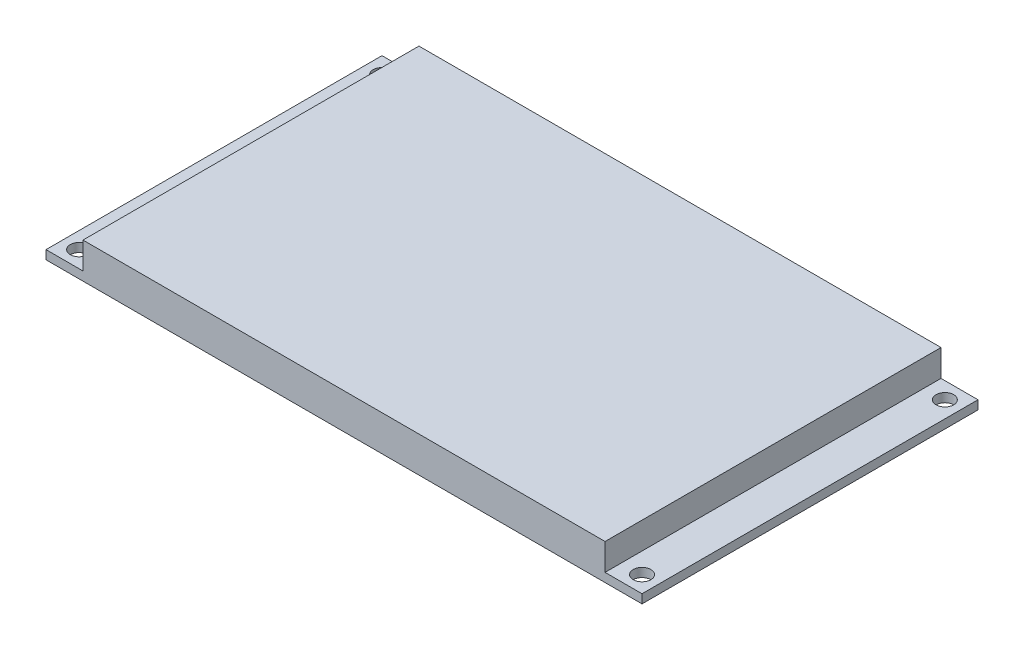
ISO-10303-21;
HEADER;
FILE_DESCRIPTION(('STEP AP214'),'2;1');
FILE_NAME('part.step','',(''),(''),'','','');
FILE_SCHEMA(('AUTOMOTIVE_DESIGN { 1 0 10303 214 1 1 1 1 }'));
ENDSEC;
DATA;
#1=APPLICATION_CONTEXT('core data for automotive mechanical design processes');
#2=APPLICATION_PROTOCOL_DEFINITION('international standard','automotive_design',2000,#1);
#3=PRODUCT_CONTEXT('',#1,'mechanical');
#4=PRODUCT('Part','Part','',(#3));
#5=PRODUCT_RELATED_PRODUCT_CATEGORY('part','',(#4));
#6=PRODUCT_DEFINITION_FORMATION('','',#4);
#7=PRODUCT_DEFINITION_CONTEXT('part definition',#1,'design');
#8=PRODUCT_DEFINITION('design','',#6,#7);
#9=PRODUCT_DEFINITION_SHAPE('','',#8);
#10=(LENGTH_UNIT() NAMED_UNIT(*) SI_UNIT(.MILLI.,.METRE.));
#11=(NAMED_UNIT(*) PLANE_ANGLE_UNIT() SI_UNIT($,.RADIAN.));
#12=(NAMED_UNIT(*) SI_UNIT($,.STERADIAN.) SOLID_ANGLE_UNIT());
#13=UNCERTAINTY_MEASURE_WITH_UNIT(LENGTH_MEASURE(1.E-05),#10,'distance_accuracy_value','');
#14=(GEOMETRIC_REPRESENTATION_CONTEXT(3) GLOBAL_UNCERTAINTY_ASSIGNED_CONTEXT((#13)) GLOBAL_UNIT_ASSIGNED_CONTEXT((#10,
#11,#12)) REPRESENTATION_CONTEXT('',''));
#15=CARTESIAN_POINT('',(0.,0.,0.));
#16=DIRECTION('',(0.,0.,1.));
#17=DIRECTION('',(1.,0.,0.));
#18=AXIS2_PLACEMENT_3D('',#15,#16,#17);
#19=CARTESIAN_POINT('',(0.,1.6,0.));
#20=DIRECTION('',(0.,-1.,0.));
#21=DIRECTION('',(0.,0.,-1.));
#22=AXIS2_PLACEMENT_3D('',#19,#20,#21);
#23=PLANE('',#22);
#24=CARTESIAN_POINT('',(3.,1.6,-3.));
#25=DIRECTION('',(0.,1.,0.));
#26=DIRECTION('',(0.,0.,1.));
#27=AXIS2_PLACEMENT_3D('',#24,#25,#26);
#28=CIRCLE('',#27,1.6);
#29=CARTESIAN_POINT('',(3.,1.6,-1.4));
#30=VERTEX_POINT('',#29);
#31=EDGE_CURVE('E198',#30,#30,#28,.T.);
#32=ORIENTED_EDGE('',*,*,#31,.F.);
#33=EDGE_LOOP('',(#32));
#34=FACE_BOUND('',#33,.T.);
#35=CARTESIAN_POINT('',(3.,1.6,-57.88));
#36=DIRECTION('',(0.,1.,0.));
#37=DIRECTION('',(0.,0.,1.));
#38=AXIS2_PLACEMENT_3D('',#35,#36,#37);
#39=CIRCLE('',#38,1.6);
#40=CARTESIAN_POINT('',(3.,1.6,-56.28));
#41=VERTEX_POINT('',#40);
#42=EDGE_CURVE('E204',#41,#41,#39,.T.);
#43=ORIENTED_EDGE('',*,*,#42,.F.);
#44=EDGE_LOOP('',(#43));
#45=FACE_BOUND('',#44,.T.);
#46=DIRECTION('',(0.,0.,1.));
#47=VECTOR('',#46,1.);
#48=CARTESIAN_POINT('',(6.7,1.6,-60.88));
#49=LINE('',#48,#47);
#50=CARTESIAN_POINT('',(6.7,1.6,-60.88));
#51=VERTEX_POINT('',#50);
#52=CARTESIAN_POINT('',(6.7,1.6,0.));
#53=VERTEX_POINT('',#52);
#54=EDGE_CURVE('E153',#51,#53,#49,.T.);
#55=ORIENTED_EDGE('',*,*,#54,.F.);
#56=DIRECTION('',(-1.,0.,0.));
#57=VECTOR('',#56,1.);
#58=CARTESIAN_POINT('',(0.,1.6,-60.88));
#59=LINE('',#58,#57);
#60=CARTESIAN_POINT('',(0.,1.6,-60.88));
#61=VERTEX_POINT('',#60);
#62=EDGE_CURVE('E218',#51,#61,#59,.T.);
#63=ORIENTED_EDGE('',*,*,#62,.T.);
#64=DIRECTION('',(0.,0.,1.));
#65=VECTOR('',#64,1.);
#66=CARTESIAN_POINT('',(0.,1.6,0.));
#67=LINE('',#66,#65);
#68=CARTESIAN_POINT('',(0.,1.6,0.));
#69=VERTEX_POINT('',#68);
#70=EDGE_CURVE('E209',#61,#69,#67,.T.);
#71=ORIENTED_EDGE('',*,*,#70,.T.);
#72=DIRECTION('',(1.,0.,0.));
#73=VECTOR('',#72,1.);
#74=CARTESIAN_POINT('',(0.,1.6,0.));
#75=LINE('',#74,#73);
#76=EDGE_CURVE('E214',#69,#53,#75,.T.);
#77=ORIENTED_EDGE('',*,*,#76,.T.);
#78=EDGE_LOOP('',(#55,#63,#71,#77));
#79=FACE_BOUND('',#78,.T.);
#80=ADVANCED_FACE('F41',(#34,#45,#79),#23,.F.);
#81=CARTESIAN_POINT('',(105.,1.6,-57.88));
#82=DIRECTION('',(0.,1.,0.));
#83=DIRECTION('',(0.,0.,-1.));
#84=AXIS2_PLACEMENT_3D('',#81,#82,#83);
#85=CIRCLE('',#84,1.6);
#86=CARTESIAN_POINT('',(105.,1.6,-59.48));
#87=VERTEX_POINT('',#86);
#88=EDGE_CURVE('E186',#87,#87,#85,.T.);
#89=ORIENTED_EDGE('',*,*,#88,.F.);
#90=EDGE_LOOP('',(#89));
#91=FACE_BOUND('',#90,.T.);
#92=CARTESIAN_POINT('',(105.,1.6,-3.));
#93=DIRECTION('',(0.,1.,0.));
#94=DIRECTION('',(0.,0.,-1.));
#95=AXIS2_PLACEMENT_3D('',#92,#93,#94);
#96=CIRCLE('',#95,1.6);
#97=CARTESIAN_POINT('',(105.,1.6,-4.6));
#98=VERTEX_POINT('',#97);
#99=EDGE_CURVE('E192',#98,#98,#96,.T.);
#100=ORIENTED_EDGE('',*,*,#99,.F.);
#101=EDGE_LOOP('',(#100));
#102=FACE_BOUND('',#101,.T.);
#103=DIRECTION('',(0.,0.,-1.));
#104=VECTOR('',#103,1.);
#105=CARTESIAN_POINT('',(101.3,1.6,-60.88));
#106=LINE('',#105,#104);
#107=CARTESIAN_POINT('',(101.3,1.6,0.));
#108=VERTEX_POINT('',#107);
#109=CARTESIAN_POINT('',(101.3,1.6,-60.88));
#110=VERTEX_POINT('',#109);
#111=EDGE_CURVE('E156',#108,#110,#106,.T.);
#112=ORIENTED_EDGE('',*,*,#111,.F.);
#113=CARTESIAN_POINT('',(108.,1.6,0.));
#114=VERTEX_POINT('',#113);
#115=EDGE_CURVE('E212',#108,#114,#75,.T.);
#116=ORIENTED_EDGE('',*,*,#115,.T.);
#117=DIRECTION('',(0.,0.,-1.));
#118=VECTOR('',#117,1.);
#119=CARTESIAN_POINT('',(108.,1.6,0.));
#120=LINE('',#119,#118);
#121=CARTESIAN_POINT('',(108.,1.6,-60.88));
#122=VERTEX_POINT('',#121);
#123=EDGE_CURVE('E216',#114,#122,#120,.T.);
#124=ORIENTED_EDGE('',*,*,#123,.T.);
#125=EDGE_CURVE('E219',#122,#110,#59,.T.);
#126=ORIENTED_EDGE('',*,*,#125,.T.);
#127=EDGE_LOOP('',(#112,#116,#124,#126));
#128=FACE_BOUND('',#127,.T.);
#129=ADVANCED_FACE('F265',(#91,#102,#128),#23,.F.);
#130=CARTESIAN_POINT('',(0.,0.,0.));
#131=DIRECTION('',(0.,-1.,0.));
#132=DIRECTION('',(0.,0.,-1.));
#133=AXIS2_PLACEMENT_3D('',#130,#131,#132);
#134=PLANE('',#133);
#135=DIRECTION('',(-1.,0.,0.));
#136=VECTOR('',#135,1.);
#137=CARTESIAN_POINT('',(0.,0.,-12.66));
#138=LINE('',#137,#136);
#139=CARTESIAN_POINT('',(3.,0.,-12.66));
#140=VERTEX_POINT('',#139);
#141=CARTESIAN_POINT('',(0.,0.,-12.66));
#142=VERTEX_POINT('',#141);
#143=EDGE_CURVE('E56',#140,#142,#138,.T.);
#144=ORIENTED_EDGE('',*,*,#143,.F.);
#145=DIRECTION('',(0.,0.,1.));
#146=VECTOR('',#145,1.);
#147=CARTESIAN_POINT('',(3.,0.,-12.66));
#148=LINE('',#147,#146);
#149=CARTESIAN_POINT('',(3.,0.,-48.22));
#150=VERTEX_POINT('',#149);
#151=EDGE_CURVE('E445',#150,#140,#148,.T.);
#152=ORIENTED_EDGE('',*,*,#151,.F.);
#153=DIRECTION('',(1.,0.,0.));
#154=VECTOR('',#153,1.);
#155=CARTESIAN_POINT('',(0.,0.,-48.22));
#156=LINE('',#155,#154);
#157=CARTESIAN_POINT('',(0.,0.,-48.22));
#158=VERTEX_POINT('',#157);
#159=EDGE_CURVE('E451',#158,#150,#156,.T.);
#160=ORIENTED_EDGE('',*,*,#159,.F.);
#161=DIRECTION('',(0.,0.,1.));
#162=VECTOR('',#161,1.);
#163=CARTESIAN_POINT('',(0.,0.,0.));
#164=LINE('',#163,#162);
#165=CARTESIAN_POINT('',(0.,0.,-60.88));
#166=VERTEX_POINT('',#165);
#167=EDGE_CURVE('E152',#166,#158,#164,.T.);
#168=ORIENTED_EDGE('',*,*,#167,.F.);
#169=DIRECTION('',(-1.,0.,0.));
#170=VECTOR('',#169,1.);
#171=CARTESIAN_POINT('',(0.,0.,-60.88));
#172=LINE('',#171,#170);
#173=CARTESIAN_POINT('',(108.,0.,-60.88));
#174=VERTEX_POINT('',#173);
#175=EDGE_CURVE('E213',#174,#166,#172,.T.);
#176=ORIENTED_EDGE('',*,*,#175,.F.);
#177=DIRECTION('',(0.,0.,-1.));
#178=VECTOR('',#177,1.);
#179=CARTESIAN_POINT('',(108.,0.,0.));
#180=LINE('',#179,#178);
#181=CARTESIAN_POINT('',(108.,0.,0.));
#182=VERTEX_POINT('',#181);
#183=EDGE_CURVE('E225',#182,#174,#180,.T.);
#184=ORIENTED_EDGE('',*,*,#183,.F.);
#185=DIRECTION('',(1.,0.,0.));
#186=VECTOR('',#185,1.);
#187=CARTESIAN_POINT('',(0.,0.,0.));
#188=LINE('',#187,#186);
#189=CARTESIAN_POINT('',(0.,0.,0.));
#190=VERTEX_POINT('',#189);
#191=EDGE_CURVE('E223',#190,#182,#188,.T.);
#192=ORIENTED_EDGE('',*,*,#191,.F.);
#193=EDGE_CURVE('E61',#142,#190,#164,.T.);
#194=ORIENTED_EDGE('',*,*,#193,.F.);
#195=EDGE_LOOP('',(#144,#152,#160,#168,#176,#184,#192,#194));
#196=FACE_BOUND('',#195,.T.);
#197=CARTESIAN_POINT('',(105.,0.,-3.));
#198=DIRECTION('',(0.,1.,0.));
#199=DIRECTION('',(0.,0.,-1.));
#200=AXIS2_PLACEMENT_3D('',#197,#198,#199);
#201=CIRCLE('',#200,1.6);
#202=CARTESIAN_POINT('',(105.,0.,-4.6));
#203=VERTEX_POINT('',#202);
#204=EDGE_CURVE('E189',#203,#203,#201,.T.);
#205=ORIENTED_EDGE('',*,*,#204,.T.);
#206=EDGE_LOOP('',(#205));
#207=FACE_BOUND('',#206,.T.);
#208=CARTESIAN_POINT('',(3.,0.,-57.88));
#209=DIRECTION('',(0.,1.,0.));
#210=DIRECTION('',(0.,0.,1.));
#211=AXIS2_PLACEMENT_3D('',#208,#209,#210);
#212=CIRCLE('',#211,1.6);
#213=CARTESIAN_POINT('',(3.,0.,-56.28));
#214=VERTEX_POINT('',#213);
#215=EDGE_CURVE('E201',#214,#214,#212,.T.);
#216=ORIENTED_EDGE('',*,*,#215,.T.);
#217=EDGE_LOOP('',(#216));
#218=FACE_BOUND('',#217,.T.);
#219=CARTESIAN_POINT('',(3.,0.,-3.));
#220=DIRECTION('',(0.,1.,0.));
#221=DIRECTION('',(0.,0.,1.));
#222=AXIS2_PLACEMENT_3D('',#219,#220,#221);
#223=CIRCLE('',#222,1.6);
#224=CARTESIAN_POINT('',(3.,0.,-1.4));
#225=VERTEX_POINT('',#224);
#226=EDGE_CURVE('E195',#225,#225,#223,.T.);
#227=ORIENTED_EDGE('',*,*,#226,.T.);
#228=EDGE_LOOP('',(#227));
#229=FACE_BOUND('',#228,.T.);
#230=CARTESIAN_POINT('',(105.,0.,-57.88));
#231=DIRECTION('',(0.,1.,0.));
#232=DIRECTION('',(0.,0.,-1.));
#233=AXIS2_PLACEMENT_3D('',#230,#231,#232);
#234=CIRCLE('',#233,1.6);
#235=CARTESIAN_POINT('',(105.,0.,-59.48));
#236=VERTEX_POINT('',#235);
#237=EDGE_CURVE('E185',#236,#236,#234,.T.);
#238=ORIENTED_EDGE('',*,*,#237,.T.);
#239=EDGE_LOOP('',(#238));
#240=FACE_BOUND('',#239,.T.);
#241=ADVANCED_FACE('F241',(#196,#207,#218,#229,#240),#134,.T.);
#242=CARTESIAN_POINT('',(0.,1.6,0.));
#243=DIRECTION('',(1.,0.,0.));
#244=DIRECTION('',(0.,0.,-1.));
#245=AXIS2_PLACEMENT_3D('',#242,#243,#244);
#246=PLANE('',#245);
#247=ORIENTED_EDGE('',*,*,#167,.T.);
#248=DIRECTION('',(0.,1.,0.));
#249=VECTOR('',#248,1.);
#250=CARTESIAN_POINT('',(0.,-8.34,-48.22));
#251=LINE('',#250,#249);
#252=CARTESIAN_POINT('',(0.,-8.34,-48.22));
#253=VERTEX_POINT('',#252);
#254=EDGE_CURVE('E133',#253,#158,#251,.T.);
#255=ORIENTED_EDGE('',*,*,#254,.F.);
#256=DIRECTION('',(0.,0.,-1.));
#257=VECTOR('',#256,1.);
#258=CARTESIAN_POINT('',(0.,-8.34,-12.66));
#259=LINE('',#258,#257);
#260=CARTESIAN_POINT('',(0.,-8.34,-12.66));
#261=VERTEX_POINT('',#260);
#262=EDGE_CURVE('E139',#261,#253,#259,.T.);
#263=ORIENTED_EDGE('',*,*,#262,.F.);
#264=DIRECTION('',(0.,1.,0.));
#265=VECTOR('',#264,1.);
#266=CARTESIAN_POINT('',(0.,-8.34,-12.66));
#267=LINE('',#266,#265);
#268=EDGE_CURVE('E443',#261,#142,#267,.T.);
#269=ORIENTED_EDGE('',*,*,#268,.T.);
#270=ORIENTED_EDGE('',*,*,#193,.T.);
#271=DIRECTION('',(0.,-1.,0.));
#272=VECTOR('',#271,1.);
#273=CARTESIAN_POINT('',(0.,1.6,0.));
#274=LINE('',#273,#272);
#275=EDGE_CURVE('E11',#69,#190,#274,.T.);
#276=ORIENTED_EDGE('',*,*,#275,.F.);
#277=ORIENTED_EDGE('',*,*,#70,.F.);
#278=DIRECTION('',(0.,-1.,0.));
#279=VECTOR('',#278,1.);
#280=CARTESIAN_POINT('',(0.,1.6,-60.88));
#281=LINE('',#280,#279);
#282=EDGE_CURVE('E221',#61,#166,#281,.T.);
#283=ORIENTED_EDGE('',*,*,#282,.T.);
#284=EDGE_LOOP('',(#247,#255,#263,#269,#270,#276,#277,#283));
#285=FACE_BOUND('',#284,.T.);
#286=ADVANCED_FACE('F43',(#285),#246,.F.);
#287=CARTESIAN_POINT('',(0.,1.6,0.));
#288=DIRECTION('',(0.,0.,-1.));
#289=DIRECTION('',(-1.,0.,0.));
#290=AXIS2_PLACEMENT_3D('',#287,#288,#289);
#291=PLANE('',#290);
#292=ORIENTED_EDGE('',*,*,#191,.T.);
#293=DIRECTION('',(0.,-1.,0.));
#294=VECTOR('',#293,1.);
#295=CARTESIAN_POINT('',(108.,1.6,0.));
#296=LINE('',#295,#294);
#297=EDGE_CURVE('E49',#114,#182,#296,.T.);
#298=ORIENTED_EDGE('',*,*,#297,.F.);
#299=ORIENTED_EDGE('',*,*,#115,.F.);
#300=DIRECTION('',(0.,-1.,0.));
#301=VECTOR('',#300,1.);
#302=CARTESIAN_POINT('',(101.3,6.45,0.));
#303=LINE('',#302,#301);
#304=CARTESIAN_POINT('',(101.3,6.45,0.));
#305=VERTEX_POINT('',#304);
#306=EDGE_CURVE('E179',#305,#108,#303,.T.);
#307=ORIENTED_EDGE('',*,*,#306,.F.);
#308=DIRECTION('',(1.,0.,0.));
#309=VECTOR('',#308,1.);
#310=CARTESIAN_POINT('',(6.70000000000001,6.45,0.));
#311=LINE('',#310,#309);
#312=CARTESIAN_POINT('',(6.70000000000001,6.45,0.));
#313=VERTEX_POINT('',#312);
#314=EDGE_CURVE('E165',#313,#305,#311,.T.);
#315=ORIENTED_EDGE('',*,*,#314,.F.);
#316=DIRECTION('',(0.,-1.,0.));
#317=VECTOR('',#316,1.);
#318=CARTESIAN_POINT('',(6.70000000000001,6.45,0.));
#319=LINE('',#318,#317);
#320=EDGE_CURVE('E182',#313,#53,#319,.T.);
#321=ORIENTED_EDGE('',*,*,#320,.T.);
#322=ORIENTED_EDGE('',*,*,#76,.F.);
#323=ORIENTED_EDGE('',*,*,#275,.T.);
#324=EDGE_LOOP('',(#292,#298,#299,#307,#315,#321,#322,#323));
#325=FACE_BOUND('',#324,.T.);
#326=ADVANCED_FACE('F266',(#325),#291,.F.);
#327=CARTESIAN_POINT('',(108.,1.6,0.));
#328=DIRECTION('',(-1.,0.,0.));
#329=DIRECTION('',(0.,0.,1.));
#330=AXIS2_PLACEMENT_3D('',#327,#328,#329);
#331=PLANE('',#330);
#332=ORIENTED_EDGE('',*,*,#183,.T.);
#333=DIRECTION('',(0.,-1.,0.));
#334=VECTOR('',#333,1.);
#335=CARTESIAN_POINT('',(108.,1.6,-60.88));
#336=LINE('',#335,#334);
#337=EDGE_CURVE('E229',#122,#174,#336,.T.);
#338=ORIENTED_EDGE('',*,*,#337,.F.);
#339=ORIENTED_EDGE('',*,*,#123,.F.);
#340=ORIENTED_EDGE('',*,*,#297,.T.);
#341=EDGE_LOOP('',(#332,#338,#339,#340));
#342=FACE_BOUND('',#341,.T.);
#343=ADVANCED_FACE('F236',(#342),#331,.F.);
#344=CARTESIAN_POINT('',(0.,1.6,-60.88));
#345=DIRECTION('',(0.,0.,1.));
#346=DIRECTION('',(1.,0.,0.));
#347=AXIS2_PLACEMENT_3D('',#344,#345,#346);
#348=PLANE('',#347);
#349=ORIENTED_EDGE('',*,*,#175,.T.);
#350=ORIENTED_EDGE('',*,*,#282,.F.);
#351=ORIENTED_EDGE('',*,*,#62,.F.);
#352=DIRECTION('',(0.,-1.,0.));
#353=VECTOR('',#352,1.);
#354=CARTESIAN_POINT('',(6.7,6.45,-60.88));
#355=LINE('',#354,#353);
#356=CARTESIAN_POINT('',(6.7,6.45,-60.88));
#357=VERTEX_POINT('',#356);
#358=EDGE_CURVE('E170',#357,#51,#355,.T.);
#359=ORIENTED_EDGE('',*,*,#358,.F.);
#360=DIRECTION('',(-1.,0.,0.));
#361=VECTOR('',#360,1.);
#362=CARTESIAN_POINT('',(6.7,6.45,-60.88));
#363=LINE('',#362,#361);
#364=CARTESIAN_POINT('',(101.3,6.45,-60.88));
#365=VERTEX_POINT('',#364);
#366=EDGE_CURVE('E169',#365,#357,#363,.T.);
#367=ORIENTED_EDGE('',*,*,#366,.F.);
#368=DIRECTION('',(0.,-1.,0.));
#369=VECTOR('',#368,1.);
#370=CARTESIAN_POINT('',(101.3,6.45,-60.88));
#371=LINE('',#370,#369);
#372=EDGE_CURVE('E176',#365,#110,#371,.T.);
#373=ORIENTED_EDGE('',*,*,#372,.T.);
#374=ORIENTED_EDGE('',*,*,#125,.F.);
#375=ORIENTED_EDGE('',*,*,#337,.T.);
#376=EDGE_LOOP('',(#349,#350,#351,#359,#367,#373,#374,#375));
#377=FACE_BOUND('',#376,.T.);
#378=ADVANCED_FACE('F245',(#377),#348,.F.);
#379=CARTESIAN_POINT('',(3.,1.6,-57.88));
#380=DIRECTION('',(0.,-1.,0.));
#381=DIRECTION('',(0.,0.,-1.));
#382=AXIS2_PLACEMENT_3D('',#379,#380,#381);
#383=CYLINDRICAL_SURFACE('',#382,1.6);
#384=ORIENTED_EDGE('',*,*,#42,.T.);
#385=EDGE_LOOP('',(#384));
#386=FACE_BOUND('',#385,.T.);
#387=ORIENTED_EDGE('',*,*,#215,.F.);
#388=EDGE_LOOP('',(#387));
#389=FACE_BOUND('',#388,.T.);
#390=ADVANCED_FACE('F286',(#386,#389),#383,.F.);
#391=CARTESIAN_POINT('',(3.,1.6,-3.));
#392=DIRECTION('',(0.,-1.,0.));
#393=DIRECTION('',(0.,0.,-1.));
#394=AXIS2_PLACEMENT_3D('',#391,#392,#393);
#395=CYLINDRICAL_SURFACE('',#394,1.6);
#396=ORIENTED_EDGE('',*,*,#31,.T.);
#397=EDGE_LOOP('',(#396));
#398=FACE_BOUND('',#397,.T.);
#399=ORIENTED_EDGE('',*,*,#226,.F.);
#400=EDGE_LOOP('',(#399));
#401=FACE_BOUND('',#400,.T.);
#402=ADVANCED_FACE('F294',(#398,#401),#395,.F.);
#403=CARTESIAN_POINT('',(105.,1.6,-3.));
#404=DIRECTION('',(0.,-1.,0.));
#405=DIRECTION('',(0.,0.,-1.));
#406=AXIS2_PLACEMENT_3D('',#403,#404,#405);
#407=CYLINDRICAL_SURFACE('',#406,1.6);
#408=ORIENTED_EDGE('',*,*,#99,.T.);
#409=EDGE_LOOP('',(#408));
#410=FACE_BOUND('',#409,.T.);
#411=ORIENTED_EDGE('',*,*,#204,.F.);
#412=EDGE_LOOP('',(#411));
#413=FACE_BOUND('',#412,.T.);
#414=ADVANCED_FACE('F299',(#410,#413),#407,.F.);
#415=CARTESIAN_POINT('',(105.,1.6,-57.88));
#416=DIRECTION('',(0.,-1.,0.));
#417=DIRECTION('',(0.,0.,-1.));
#418=AXIS2_PLACEMENT_3D('',#415,#416,#417);
#419=CYLINDRICAL_SURFACE('',#418,1.6);
#420=ORIENTED_EDGE('',*,*,#88,.T.);
#421=EDGE_LOOP('',(#420));
#422=FACE_BOUND('',#421,.T.);
#423=ORIENTED_EDGE('',*,*,#237,.F.);
#424=EDGE_LOOP('',(#423));
#425=FACE_BOUND('',#424,.T.);
#426=ADVANCED_FACE('F310',(#422,#425),#419,.F.);
#427=CARTESIAN_POINT('',(6.7,6.45,-60.88));
#428=DIRECTION('',(1.,0.,0.));
#429=DIRECTION('',(0.,0.,-1.));
#430=AXIS2_PLACEMENT_3D('',#427,#428,#429);
#431=PLANE('',#430);
#432=ORIENTED_EDGE('',*,*,#54,.T.);
#433=ORIENTED_EDGE('',*,*,#320,.F.);
#434=DIRECTION('',(0.,0.,1.));
#435=VECTOR('',#434,1.);
#436=CARTESIAN_POINT('',(6.7,6.45,-60.88));
#437=LINE('',#436,#435);
#438=EDGE_CURVE('E162',#357,#313,#437,.T.);
#439=ORIENTED_EDGE('',*,*,#438,.F.);
#440=ORIENTED_EDGE('',*,*,#358,.T.);
#441=EDGE_LOOP('',(#432,#433,#439,#440));
#442=FACE_BOUND('',#441,.T.);
#443=ADVANCED_FACE('F255',(#442),#431,.F.);
#444=CARTESIAN_POINT('',(101.3,6.45,-60.88));
#445=DIRECTION('',(-1.,0.,0.));
#446=DIRECTION('',(0.,0.,1.));
#447=AXIS2_PLACEMENT_3D('',#444,#445,#446);
#448=PLANE('',#447);
#449=ORIENTED_EDGE('',*,*,#111,.T.);
#450=ORIENTED_EDGE('',*,*,#372,.F.);
#451=DIRECTION('',(0.,0.,-1.));
#452=VECTOR('',#451,1.);
#453=CARTESIAN_POINT('',(101.3,6.45,-60.88));
#454=LINE('',#453,#452);
#455=EDGE_CURVE('E167',#305,#365,#454,.T.);
#456=ORIENTED_EDGE('',*,*,#455,.F.);
#457=ORIENTED_EDGE('',*,*,#306,.T.);
#458=EDGE_LOOP('',(#449,#450,#456,#457));
#459=FACE_BOUND('',#458,.T.);
#460=ADVANCED_FACE('F263',(#459),#448,.F.);
#461=CARTESIAN_POINT('',(0.,6.45,0.));
#462=DIRECTION('',(0.,1.,0.));
#463=DIRECTION('',(0.,0.,1.));
#464=AXIS2_PLACEMENT_3D('',#461,#462,#463);
#465=PLANE('',#464);
#466=ORIENTED_EDGE('',*,*,#438,.T.);
#467=ORIENTED_EDGE('',*,*,#314,.T.);
#468=ORIENTED_EDGE('',*,*,#455,.T.);
#469=ORIENTED_EDGE('',*,*,#366,.T.);
#470=EDGE_LOOP('',(#466,#467,#468,#469));
#471=FACE_BOUND('',#470,.T.);
#472=ADVANCED_FACE('F258',(#471),#465,.T.);
#473=CARTESIAN_POINT('',(0.,-8.34,-48.22));
#474=DIRECTION('',(0.,0.,1.));
#475=DIRECTION('',(1.,0.,0.));
#476=AXIS2_PLACEMENT_3D('',#473,#474,#475);
#477=PLANE('',#476);
#478=ORIENTED_EDGE('',*,*,#159,.T.);
#479=DIRECTION('',(0.,1.,0.));
#480=VECTOR('',#479,1.);
#481=CARTESIAN_POINT('',(3.,-8.34,-48.22));
#482=LINE('',#481,#480);
#483=CARTESIAN_POINT('',(3.,-8.34,-48.22));
#484=VERTEX_POINT('',#483);
#485=EDGE_CURVE('E135',#484,#150,#482,.T.);
#486=ORIENTED_EDGE('',*,*,#485,.F.);
#487=DIRECTION('',(1.,0.,0.));
#488=VECTOR('',#487,1.);
#489=CARTESIAN_POINT('',(0.,-8.34,-48.22));
#490=LINE('',#489,#488);
#491=EDGE_CURVE('E128',#253,#484,#490,.T.);
#492=ORIENTED_EDGE('',*,*,#491,.F.);
#493=ORIENTED_EDGE('',*,*,#254,.T.);
#494=EDGE_LOOP('',(#478,#486,#492,#493));
#495=FACE_BOUND('',#494,.T.);
#496=ADVANCED_FACE('F131',(#495),#477,.F.);
#497=CARTESIAN_POINT('',(3.,-8.34,-12.66));
#498=DIRECTION('',(-1.,0.,0.));
#499=DIRECTION('',(0.,0.,1.));
#500=AXIS2_PLACEMENT_3D('',#497,#498,#499);
#501=PLANE('',#500);
#502=ORIENTED_EDGE('',*,*,#151,.T.);
#503=DIRECTION('',(0.,1.,0.));
#504=VECTOR('',#503,1.);
#505=CARTESIAN_POINT('',(3.,-8.34,-12.66));
#506=LINE('',#505,#504);
#507=CARTESIAN_POINT('',(3.,-8.34,-12.66));
#508=VERTEX_POINT('',#507);
#509=EDGE_CURVE('E158',#508,#140,#506,.T.);
#510=ORIENTED_EDGE('',*,*,#509,.F.);
#511=DIRECTION('',(0.,0.,1.));
#512=VECTOR('',#511,1.);
#513=CARTESIAN_POINT('',(3.,-8.34,-12.66));
#514=LINE('',#513,#512);
#515=EDGE_CURVE('E138',#484,#508,#514,.T.);
#516=ORIENTED_EDGE('',*,*,#515,.F.);
#517=ORIENTED_EDGE('',*,*,#485,.T.);
#518=EDGE_LOOP('',(#502,#510,#516,#517));
#519=FACE_BOUND('',#518,.T.);
#520=ADVANCED_FACE('F326',(#519),#501,.F.);
#521=CARTESIAN_POINT('',(0.,-8.34,-12.66));
#522=DIRECTION('',(0.,0.,-1.));
#523=DIRECTION('',(-1.,0.,0.));
#524=AXIS2_PLACEMENT_3D('',#521,#522,#523);
#525=PLANE('',#524);
#526=ORIENTED_EDGE('',*,*,#143,.T.);
#527=ORIENTED_EDGE('',*,*,#268,.F.);
#528=DIRECTION('',(-1.,0.,0.));
#529=VECTOR('',#528,1.);
#530=CARTESIAN_POINT('',(0.,-8.34,-12.66));
#531=LINE('',#530,#529);
#532=EDGE_CURVE('E144',#508,#261,#531,.T.);
#533=ORIENTED_EDGE('',*,*,#532,.F.);
#534=ORIENTED_EDGE('',*,*,#509,.T.);
#535=EDGE_LOOP('',(#526,#527,#533,#534));
#536=FACE_BOUND('',#535,.T.);
#537=ADVANCED_FACE('F329',(#536),#525,.F.);
#538=CARTESIAN_POINT('',(0.,-8.34,0.));
#539=DIRECTION('',(0.,-1.,0.));
#540=DIRECTION('',(0.,0.,-1.));
#541=AXIS2_PLACEMENT_3D('',#538,#539,#540);
#542=PLANE('',#541);
#543=ORIENTED_EDGE('',*,*,#262,.T.);
#544=ORIENTED_EDGE('',*,*,#491,.T.);
#545=ORIENTED_EDGE('',*,*,#515,.T.);
#546=ORIENTED_EDGE('',*,*,#532,.T.);
#547=EDGE_LOOP('',(#543,#544,#545,#546));
#548=FACE_BOUND('',#547,.T.);
#549=ADVANCED_FACE('F142',(#548),#542,.T.);
#550=CLOSED_SHELL('',(#80,#129,#241,#286,#326,#343,#378,#390,#402,#414,#426,#443,#460,#472,#496,
#520,#537,#549));
#551=MANIFOLD_SOLID_BREP('B2',#550);
#552=ADVANCED_BREP_SHAPE_REPRESENTATION('',(#18,#551),#14);
#553=SHAPE_DEFINITION_REPRESENTATION(#9,#552);
ENDSEC;
END-ISO-10303-21;
